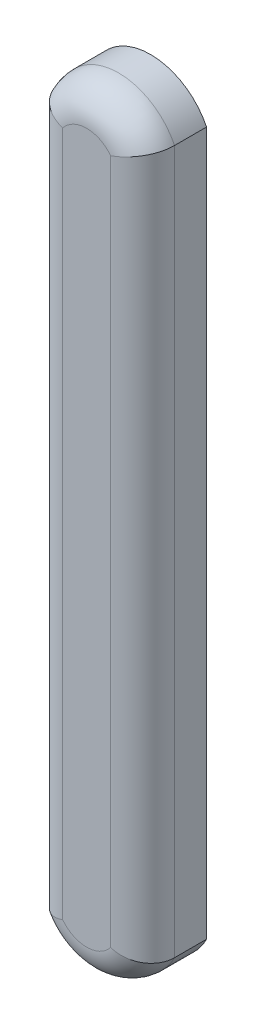
ISO-10303-21;
HEADER;
FILE_DESCRIPTION(('STEP AP214'),'2;1');
FILE_NAME('part.step','',(''),(''),'','','');
FILE_SCHEMA(('AUTOMOTIVE_DESIGN { 1 0 10303 214 1 1 1 1 }'));
ENDSEC;
DATA;
#1=APPLICATION_CONTEXT('core data for automotive mechanical design processes');
#2=APPLICATION_PROTOCOL_DEFINITION('international standard','automotive_design',2000,#1);
#3=PRODUCT_CONTEXT('',#1,'mechanical');
#4=PRODUCT('Part','Part','',(#3));
#5=PRODUCT_RELATED_PRODUCT_CATEGORY('part','',(#4));
#6=PRODUCT_DEFINITION_FORMATION('','',#4);
#7=PRODUCT_DEFINITION_CONTEXT('part definition',#1,'design');
#8=PRODUCT_DEFINITION('design','',#6,#7);
#9=PRODUCT_DEFINITION_SHAPE('','',#8);
#10=(LENGTH_UNIT() NAMED_UNIT(*) SI_UNIT(.MILLI.,.METRE.));
#11=(NAMED_UNIT(*) PLANE_ANGLE_UNIT() SI_UNIT($,.RADIAN.));
#12=(NAMED_UNIT(*) SI_UNIT($,.STERADIAN.) SOLID_ANGLE_UNIT());
#13=UNCERTAINTY_MEASURE_WITH_UNIT(LENGTH_MEASURE(1.E-05),#10,'distance_accuracy_value','');
#14=(GEOMETRIC_REPRESENTATION_CONTEXT(3) GLOBAL_UNCERTAINTY_ASSIGNED_CONTEXT((#13)) GLOBAL_UNIT_ASSIGNED_CONTEXT((#10,
#11,#12)) REPRESENTATION_CONTEXT('',''));
#15=CARTESIAN_POINT('',(0.,0.,0.));
#16=DIRECTION('',(0.,0.,1.));
#17=DIRECTION('',(1.,0.,0.));
#18=AXIS2_PLACEMENT_3D('',#15,#16,#17);
#19=CARTESIAN_POINT('',(0.175,0.0859698267459457,0.2));
#20=DIRECTION('',(0.,0.,-1.));
#21=DIRECTION('',(-1.,0.,0.));
#22=AXIS2_PLACEMENT_3D('',#19,#20,#21);
#23=CYLINDRICAL_SURFACE('',#22,0.194976437321867);
#24=DIRECTION('',(0.,0.,-1.));
#25=VECTOR('',#24,1.);
#26=CARTESIAN_POINT('',(0.35,0.,0.2));
#27=LINE('',#26,#25);
#28=CARTESIAN_POINT('',(0.35,0.,0.1));
#29=VERTEX_POINT('',#28);
#30=CARTESIAN_POINT('',(0.35,0.,0.));
#31=VERTEX_POINT('',#30);
#32=EDGE_CURVE('E92',#29,#31,#27,.T.);
#33=ORIENTED_EDGE('',*,*,#32,.F.);
#34=CARTESIAN_POINT('',(0.175,0.0859698267459457,0.1));
#35=DIRECTION('',(0.,0.,1.));
#36=DIRECTION('',(1.,0.,0.));
#37=AXIS2_PLACEMENT_3D('',#34,#35,#36);
#38=CIRCLE('',#37,0.194976437321867);
#39=CARTESIAN_POINT('',(0.,0.,0.1));
#40=VERTEX_POINT('',#39);
#41=EDGE_CURVE('E134',#29,#40,#38,.F.);
#42=ORIENTED_EDGE('',*,*,#41,.T.);
#43=DIRECTION('',(0.,0.,-1.));
#44=VECTOR('',#43,1.);
#45=CARTESIAN_POINT('',(0.,0.,0.2));
#46=LINE('',#45,#44);
#47=CARTESIAN_POINT('',(0.,0.,0.));
#48=VERTEX_POINT('',#47);
#49=EDGE_CURVE('E113',#40,#48,#46,.T.);
#50=ORIENTED_EDGE('',*,*,#49,.T.);
#51=CARTESIAN_POINT('',(0.175,0.0859698267459457,0.));
#52=DIRECTION('',(0.,0.,1.));
#53=DIRECTION('',(1.,0.,0.));
#54=AXIS2_PLACEMENT_3D('',#51,#52,#53);
#55=CIRCLE('',#54,0.194976437321867);
#56=EDGE_CURVE('E109',#48,#31,#55,.T.);
#57=ORIENTED_EDGE('',*,*,#56,.T.);
#58=EDGE_LOOP('',(#33,#42,#50,#57));
#59=FACE_BOUND('',#58,.T.);
#60=ADVANCED_FACE('F33',(#59),#23,.T.);
#61=CARTESIAN_POINT('',(0.35,0.,0.2));
#62=DIRECTION('',(-1.,0.,0.));
#63=DIRECTION('',(0.,0.,1.));
#64=AXIS2_PLACEMENT_3D('',#61,#62,#63);
#65=PLANE('',#64);
#66=DIRECTION('',(0.,0.,-1.));
#67=VECTOR('',#66,1.);
#68=CARTESIAN_POINT('',(0.35,2.2,0.2));
#69=LINE('',#68,#67);
#70=CARTESIAN_POINT('',(0.35,2.2,0.1));
#71=VERTEX_POINT('',#70);
#72=CARTESIAN_POINT('',(0.35,2.2,0.));
#73=VERTEX_POINT('',#72);
#74=EDGE_CURVE('E103',#71,#73,#69,.T.);
#75=ORIENTED_EDGE('',*,*,#74,.F.);
#76=DIRECTION('',(0.,1.,0.));
#77=VECTOR('',#76,1.);
#78=CARTESIAN_POINT('',(0.35,0.,0.1));
#79=LINE('',#78,#77);
#80=EDGE_CURVE('E47',#71,#29,#79,.F.);
#81=ORIENTED_EDGE('',*,*,#80,.T.);
#82=ORIENTED_EDGE('',*,*,#32,.T.);
#83=DIRECTION('',(0.,1.,0.));
#84=VECTOR('',#83,1.);
#85=CARTESIAN_POINT('',(0.35,0.,0.));
#86=LINE('',#85,#84);
#87=EDGE_CURVE('E95',#31,#73,#86,.T.);
#88=ORIENTED_EDGE('',*,*,#87,.T.);
#89=EDGE_LOOP('',(#75,#81,#82,#88));
#90=FACE_BOUND('',#89,.T.);
#91=ADVANCED_FACE('F94',(#90),#65,.F.);
#92=CARTESIAN_POINT('',(0.175,2.11403017325405,0.2));
#93=DIRECTION('',(0.,0.,-1.));
#94=DIRECTION('',(-1.,0.,0.));
#95=AXIS2_PLACEMENT_3D('',#92,#93,#94);
#96=CYLINDRICAL_SURFACE('',#95,0.194976437321867);
#97=DIRECTION('',(0.,0.,-1.));
#98=VECTOR('',#97,1.);
#99=CARTESIAN_POINT('',(0.,2.2,0.2));
#100=LINE('',#99,#98);
#101=CARTESIAN_POINT('',(0.,2.2,0.1));
#102=VERTEX_POINT('',#101);
#103=CARTESIAN_POINT('',(0.,2.2,0.));
#104=VERTEX_POINT('',#103);
#105=EDGE_CURVE('E123',#102,#104,#100,.T.);
#106=ORIENTED_EDGE('',*,*,#105,.F.);
#107=CARTESIAN_POINT('',(0.175,2.11403017325405,0.1));
#108=DIRECTION('',(0.,0.,1.));
#109=DIRECTION('',(1.,0.,0.));
#110=AXIS2_PLACEMENT_3D('',#107,#108,#109);
#111=CIRCLE('',#110,0.194976437321867);
#112=EDGE_CURVE('E11',#102,#71,#111,.F.);
#113=ORIENTED_EDGE('',*,*,#112,.T.);
#114=ORIENTED_EDGE('',*,*,#74,.T.);
#115=CARTESIAN_POINT('',(0.175,2.11403017325405,0.));
#116=DIRECTION('',(0.,0.,1.));
#117=DIRECTION('',(-1.,0.,0.));
#118=AXIS2_PLACEMENT_3D('',#115,#116,#117);
#119=CIRCLE('',#118,0.194976437321867);
#120=EDGE_CURVE('E111',#73,#104,#119,.T.);
#121=ORIENTED_EDGE('',*,*,#120,.T.);
#122=EDGE_LOOP('',(#106,#113,#114,#121));
#123=FACE_BOUND('',#122,.T.);
#124=ADVANCED_FACE('F176',(#123),#96,.T.);
#125=CARTESIAN_POINT('',(0.,0.,0.2));
#126=DIRECTION('',(1.,0.,0.));
#127=DIRECTION('',(0.,0.,-1.));
#128=AXIS2_PLACEMENT_3D('',#125,#126,#127);
#129=PLANE('',#128);
#130=ORIENTED_EDGE('',*,*,#49,.F.);
#131=DIRECTION('',(0.,-1.,0.));
#132=VECTOR('',#131,1.);
#133=CARTESIAN_POINT('',(0.,2.2,0.1));
#134=LINE('',#133,#132);
#135=EDGE_CURVE('E61',#40,#102,#134,.F.);
#136=ORIENTED_EDGE('',*,*,#135,.T.);
#137=ORIENTED_EDGE('',*,*,#105,.T.);
#138=DIRECTION('',(0.,-1.,0.));
#139=VECTOR('',#138,1.);
#140=CARTESIAN_POINT('',(0.,0.,0.));
#141=LINE('',#140,#139);
#142=EDGE_CURVE('E120',#104,#48,#141,.T.);
#143=ORIENTED_EDGE('',*,*,#142,.T.);
#144=EDGE_LOOP('',(#130,#136,#137,#143));
#145=FACE_BOUND('',#144,.T.);
#146=ADVANCED_FACE('F175',(#145),#129,.F.);
#147=CARTESIAN_POINT('',(0.175,0.0859698267459457,0.2));
#148=DIRECTION('',(0.,0.,1.));
#149=DIRECTION('',(1.,0.,0.));
#150=AXIS2_PLACEMENT_3D('',#147,#148,#149);
#151=PLANE('',#150);
#152=DIRECTION('',(0.,-1.,0.));
#153=VECTOR('',#152,1.);
#154=CARTESIAN_POINT('',(0.1,0.,0.2));
#155=LINE('',#154,#153);
#156=CARTESIAN_POINT('',(0.100000000000006,2.17230129514437,0.2));
#157=VERTEX_POINT('',#156);
#158=CARTESIAN_POINT('',(0.1,0.0276987048556348,0.2));
#159=VERTEX_POINT('',#158);
#160=EDGE_CURVE('E129',#157,#159,#155,.T.);
#161=ORIENTED_EDGE('',*,*,#160,.T.);
#162=CARTESIAN_POINT('',(0.175,0.0859698267459457,0.2));
#163=DIRECTION('',(0.,0.,1.));
#164=DIRECTION('',(1.,0.,0.));
#165=AXIS2_PLACEMENT_3D('',#162,#163,#164);
#166=CIRCLE('',#165,0.0949764373218671);
#167=CARTESIAN_POINT('',(0.25,0.0276987048556345,0.2));
#168=VERTEX_POINT('',#167);
#169=EDGE_CURVE('E131',#159,#168,#166,.T.);
#170=ORIENTED_EDGE('',*,*,#169,.T.);
#171=DIRECTION('',(0.,1.,0.));
#172=VECTOR('',#171,1.);
#173=CARTESIAN_POINT('',(0.25,2.2,0.2));
#174=LINE('',#173,#172);
#175=CARTESIAN_POINT('',(0.249999999999994,2.17230129514437,0.2));
#176=VERTEX_POINT('',#175);
#177=EDGE_CURVE('E127',#168,#176,#174,.T.);
#178=ORIENTED_EDGE('',*,*,#177,.T.);
#179=CARTESIAN_POINT('',(0.175,2.11403017325405,0.2));
#180=DIRECTION('',(0.,0.,1.));
#181=DIRECTION('',(1.,0.,0.));
#182=AXIS2_PLACEMENT_3D('',#179,#180,#181);
#183=CIRCLE('',#182,0.0949764373218672);
#184=EDGE_CURVE('E102',#176,#157,#183,.T.);
#185=ORIENTED_EDGE('',*,*,#184,.T.);
#186=EDGE_LOOP('',(#161,#170,#178,#185));
#187=FACE_BOUND('',#186,.T.);
#188=ADVANCED_FACE('F180',(#187),#151,.T.);
#189=CARTESIAN_POINT('',(0.175,0.0859698267459457,0.));
#190=DIRECTION('',(0.,0.,1.));
#191=DIRECTION('',(1.,0.,0.));
#192=AXIS2_PLACEMENT_3D('',#189,#190,#191);
#193=PLANE('',#192);
#194=ORIENTED_EDGE('',*,*,#56,.F.);
#195=ORIENTED_EDGE('',*,*,#142,.F.);
#196=ORIENTED_EDGE('',*,*,#120,.F.);
#197=ORIENTED_EDGE('',*,*,#87,.F.);
#198=EDGE_LOOP('',(#194,#195,#196,#197));
#199=FACE_BOUND('',#198,.T.);
#200=ADVANCED_FACE('F107',(#199),#193,.F.);
#201=CARTESIAN_POINT('',(0.175,2.11403017325405,0.1));
#202=DIRECTION('',(0.,0.,1.));
#203=DIRECTION('',(1.,0.,0.));
#204=AXIS2_PLACEMENT_3D('',#201,#202,#203);
#205=DEGENERATE_TOROIDAL_SURFACE('',#204,0.0949764373218672,0.1,.T.);
#206=CARTESIAN_POINT('',(0.35,2.2,0.1));
#207=CARTESIAN_POINT('',(0.350005268670267,2.20000040754592,0.105511252154056));
#208=CARTESIAN_POINT('',(0.349544726083473,2.19989418803524,0.111020433796739));
#209=CARTESIAN_POINT('',(0.347731528858172,2.19947173953325,0.121874551323155));
#210=CARTESIAN_POINT('',(0.346380049196348,2.19915578713593,0.127219693839957));
#211=CARTESIAN_POINT('',(0.342823791248484,2.19831698281915,0.137602422816504));
#212=CARTESIAN_POINT('',(0.340618769337371,2.1977940718269,0.142639920990146));
#213=CARTESIAN_POINT('',(0.335428566635515,2.19654702816146,0.152267062418119));
#214=CARTESIAN_POINT('',(0.332443445191162,2.19582291079487,0.156856739704144));
#215=CARTESIAN_POINT('',(0.325756614399063,2.19417319123095,0.165506423196409));
#216=CARTESIAN_POINT('',(0.322048708236536,2.19324583736037,0.169561300463762));
#217=CARTESIAN_POINT('',(0.314048358880857,2.19120195336536,0.176991039421652));
#218=CARTESIAN_POINT('',(0.309755728604854,2.19008536266644,0.18036568261043));
#219=CARTESIAN_POINT('',(0.300608968757441,2.1876441832273,0.186426554884238));
#220=CARTESIAN_POINT('',(0.295743946563814,2.18631529375002,0.189094582015616));
#221=CARTESIAN_POINT('',(0.285685701853069,2.18347998727226,0.193577836216799));
#222=CARTESIAN_POINT('',(0.280492611405467,2.18197364150132,0.195393404007875));
#223=CARTESIAN_POINT('',(0.271464682749297,2.17925574089153,0.197746196020681));
#224=CARTESIAN_POINT('',(0.267672328405756,2.17808525366685,0.198501401199194));
#225=CARTESIAN_POINT('',(0.260055477527481,2.17566401718499,0.199567195235984));
#226=CARTESIAN_POINT('',(0.25623103898922,2.17441339335639,0.199878461996796));
#227=CARTESIAN_POINT('',(0.251610866919887,2.17285157075458,0.199990299901761));
#228=CARTESIAN_POINT('',(0.250805058561448,2.17257728559771,0.200000031817378));
#229=CARTESIAN_POINT('',(0.25,2.17230129514436,0.2));
#230=B_SPLINE_CURVE_WITH_KNOTS('',3,(#206,#207,#208,#209,#210,#211,#212,#213,#214,#215,#216,
#217,#218,#219,#220,#221,#222,#223,#224,#225,#226,#227,#228,#229),.UNSPECIFIED.,.F.,.F.,(4,2,2,
2,2,2,2,2,2,2,2,4),(0.,0.0165104363716612,0.0329991420587914,0.0494925575628399,
0.0659847186886619,0.0826250435228636,0.0992707050000554,0.116310692768043,0.133343863977416,
0.145441145514401,0.157519934417857,0.160073462740983),.UNSPECIFIED.);
#231=EDGE_CURVE('E117',#71,#176,#230,.T.);
#232=ORIENTED_EDGE('',*,*,#231,.F.);
#233=ORIENTED_EDGE('',*,*,#112,.F.);
#234=CARTESIAN_POINT('',(0.,2.2,0.1));
#235=CARTESIAN_POINT('',(-5.26867026748262E-06,2.20000040754592,0.105511252154056));
#236=CARTESIAN_POINT('',(0.000455273916526676,2.19989418803524,0.111020433796739));
#237=CARTESIAN_POINT('',(0.00226847114182762,2.19947173953325,0.121874551323155));
#238=CARTESIAN_POINT('',(0.00361995080365193,2.19915578713593,0.127219693839957));
#239=CARTESIAN_POINT('',(0.00717620875151557,2.19831698281915,0.137602422816504));
#240=CARTESIAN_POINT('',(0.00938123066262879,2.1977940718269,0.142639920990146));
#241=CARTESIAN_POINT('',(0.0145714333644853,2.19654702816146,0.152267062418119));
#242=CARTESIAN_POINT('',(0.0175565548088385,2.19582291079487,0.156856739704145));
#243=CARTESIAN_POINT('',(0.0242433856009375,2.19417319123095,0.165506423196409));
#244=CARTESIAN_POINT('',(0.0279512917634645,2.19324583736037,0.169561300463762));
#245=CARTESIAN_POINT('',(0.0359516411191437,2.19120195336536,0.176991039421652));
#246=CARTESIAN_POINT('',(0.0402442713951462,2.19008536266644,0.18036568261043));
#247=CARTESIAN_POINT('',(0.0493910312425594,2.1876441832273,0.186426554884238));
#248=CARTESIAN_POINT('',(0.0542560534361864,2.18631529375002,0.189094582015617));
#249=CARTESIAN_POINT('',(0.0643142981469309,2.18347998727226,0.193577836216799));
#250=CARTESIAN_POINT('',(0.0695073885945332,2.18197364150132,0.195393404007875));
#251=CARTESIAN_POINT('',(0.0785353172507031,2.17925574089153,0.197746196020681));
#252=CARTESIAN_POINT('',(0.0823276715942445,2.17808525366685,0.198501401199194));
#253=CARTESIAN_POINT('',(0.0899445224725191,2.17566401718499,0.199567195235984));
#254=CARTESIAN_POINT('',(0.09376896101078,2.17441339335639,0.199878461996796));
#255=CARTESIAN_POINT('',(0.0983891330801134,2.17285157075458,0.199990299901761));
#256=CARTESIAN_POINT('',(0.0991949414385524,2.17257728559771,0.200000031817378));
#257=CARTESIAN_POINT('',(0.1,2.17230129514436,0.2));
#258=B_SPLINE_CURVE_WITH_KNOTS('',3,(#234,#235,#236,#237,#238,#239,#240,#241,#242,#243,#244,
#245,#246,#247,#248,#249,#250,#251,#252,#253,#254,#255,#256,#257),.UNSPECIFIED.,.F.,.F.,(4,2,2,
2,2,2,2,2,2,2,2,4),(0.,0.0165104363716612,0.0329991420587915,0.04949255756284,
0.0659847186886619,0.0826250435228637,0.0992707050000555,0.116310692768043,0.133343863977416,
0.145441145514401,0.157519934417857,0.160073462740983),.UNSPECIFIED.);
#259=EDGE_CURVE('E38',#157,#102,#258,.F.);
#260=ORIENTED_EDGE('',*,*,#259,.F.);
#261=ORIENTED_EDGE('',*,*,#184,.F.);
#262=EDGE_LOOP('',(#232,#233,#260,#261));
#263=FACE_BOUND('',#262,.T.);
#264=ADVANCED_FACE('F35',(#263),#205,.T.);
#265=CARTESIAN_POINT('',(0.1,0.0859698267459457,0.1));
#266=DIRECTION('',(0.,1.,0.));
#267=DIRECTION('',(0.,0.,1.));
#268=AXIS2_PLACEMENT_3D('',#265,#266,#267);
#269=CYLINDRICAL_SURFACE('',#268,0.1);
#270=ORIENTED_EDGE('',*,*,#259,.T.);
#271=ORIENTED_EDGE('',*,*,#135,.F.);
#272=CARTESIAN_POINT('',(0.,0.,0.1));
#273=CARTESIAN_POINT('',(-5.26867026746337E-06,-4.07545918043041E-07,0.105511252154056));
#274=CARTESIAN_POINT('',(0.000455273916526693,0.00010581196475547,0.111020433796739));
#275=CARTESIAN_POINT('',(0.00226847114182762,0.000528260466754612,0.121874551323155));
#276=CARTESIAN_POINT('',(0.00361995080365192,0.00084421286407005,0.127219693839957));
#277=CARTESIAN_POINT('',(0.00717620875151555,0.00168301718085004,0.137602422816504));
#278=CARTESIAN_POINT('',(0.00938123066262876,0.00220592817310267,0.142639920990146));
#279=CARTESIAN_POINT('',(0.0145714333644852,0.00345297183853683,0.152267062418119));
#280=CARTESIAN_POINT('',(0.0175565548088385,0.00417708920512643,0.156856739704144));
#281=CARTESIAN_POINT('',(0.0242433856009374,0.00582680876905417,0.165506423196409));
#282=CARTESIAN_POINT('',(0.0279512917634644,0.00675416263962726,0.169561300463762));
#283=CARTESIAN_POINT('',(0.0359516411191436,0.00879804663464377,0.176991039421652));
#284=CARTESIAN_POINT('',(0.0402442713951461,0.00991463733356407,0.18036568261043));
#285=CARTESIAN_POINT('',(0.0493910312425594,0.0123558167727031,0.186426554884238));
#286=CARTESIAN_POINT('',(0.0542560534361864,0.0136847062499833,0.189094582015616));
#287=CARTESIAN_POINT('',(0.0643142981469309,0.0165200127277395,0.193577836216799));
#288=CARTESIAN_POINT('',(0.0695073885945331,0.0180263584986781,0.195393404007875));
#289=CARTESIAN_POINT('',(0.078535317250703,0.0207442591084677,0.197746196020681));
#290=CARTESIAN_POINT('',(0.0823276715942444,0.0219147463331536,0.198501401199194));
#291=CARTESIAN_POINT('',(0.089944522472519,0.0243359828150113,0.199567195235984));
#292=CARTESIAN_POINT('',(0.0937689610107799,0.0255866066436067,0.199878461996796));
#293=CARTESIAN_POINT('',(0.0983891330801134,0.0271484292454209,0.199990299901761));
#294=CARTESIAN_POINT('',(0.0991949414385524,0.0274227144022897,0.200000031817378));
#295=CARTESIAN_POINT('',(0.1,0.0276987048556429,0.2));
#296=B_SPLINE_CURVE_WITH_KNOTS('',3,(#272,#273,#274,#275,#276,#277,#278,#279,#280,#281,#282,
#283,#284,#285,#286,#287,#288,#289,#290,#291,#292,#293,#294,#295),.UNSPECIFIED.,.F.,.F.,(4,2,2,
2,2,2,2,2,2,2,2,4),(0.,0.0165104363716612,0.0329991420587914,0.0494925575628399,
0.0659847186886619,0.0826250435228637,0.0992707050000554,0.116310692768043,0.133343863977416,
0.145441145514401,0.157519934417857,0.160073462740983),.UNSPECIFIED.);
#297=EDGE_CURVE('E146',#159,#40,#296,.F.);
#298=ORIENTED_EDGE('',*,*,#297,.F.);
#299=ORIENTED_EDGE('',*,*,#160,.F.);
#300=EDGE_LOOP('',(#270,#271,#298,#299));
#301=FACE_BOUND('',#300,.T.);
#302=ADVANCED_FACE('F157',(#301),#269,.T.);
#303=CARTESIAN_POINT('',(0.25,0.0859698267459457,0.1));
#304=DIRECTION('',(0.,-1.,0.));
#305=DIRECTION('',(0.,0.,-1.));
#306=AXIS2_PLACEMENT_3D('',#303,#304,#305);
#307=CYLINDRICAL_SURFACE('',#306,0.1);
#308=ORIENTED_EDGE('',*,*,#231,.T.);
#309=ORIENTED_EDGE('',*,*,#177,.F.);
#310=CARTESIAN_POINT('',(0.35,0.,0.1));
#311=CARTESIAN_POINT('',(0.350005268670267,-4.07545918531255E-07,0.105511252154056));
#312=CARTESIAN_POINT('',(0.349544726083473,0.00010581196475498,0.111020433796739));
#313=CARTESIAN_POINT('',(0.347731528858172,0.00052826046675415,0.121874551323155));
#314=CARTESIAN_POINT('',(0.346380049196348,0.000844212864069616,0.127219693839957));
#315=CARTESIAN_POINT('',(0.342823791248484,0.00168301718084962,0.137602422816504));
#316=CARTESIAN_POINT('',(0.340618769337371,0.00220592817310223,0.142639920990146));
#317=CARTESIAN_POINT('',(0.335428566635515,0.00345297183853637,0.152267062418119));
#318=CARTESIAN_POINT('',(0.332443445191162,0.00417708920512596,0.156856739704144));
#319=CARTESIAN_POINT('',(0.325756614399063,0.00582680876905374,0.165506423196409));
#320=CARTESIAN_POINT('',(0.322048708236536,0.00675416263962687,0.169561300463762));
#321=CARTESIAN_POINT('',(0.314048358880856,0.00879804663464344,0.176991039421652));
#322=CARTESIAN_POINT('',(0.309755728604854,0.00991463733356375,0.18036568261043));
#323=CARTESIAN_POINT('',(0.300608968757441,0.0123558167727028,0.186426554884238));
#324=CARTESIAN_POINT('',(0.295743946563814,0.0136847062499829,0.189094582015616));
#325=CARTESIAN_POINT('',(0.285685701853069,0.0165200127277392,0.193577836216799));
#326=CARTESIAN_POINT('',(0.280492611405467,0.0180263584986777,0.195393404007875));
#327=CARTESIAN_POINT('',(0.271464682749297,0.0207442591084674,0.197746196020681));
#328=CARTESIAN_POINT('',(0.267672328405756,0.0219147463331533,0.198501401199194));
#329=CARTESIAN_POINT('',(0.260055477527481,0.024335982815011,0.199567195235984));
#330=CARTESIAN_POINT('',(0.25623103898922,0.0255866066436063,0.199878461996796));
#331=CARTESIAN_POINT('',(0.251610866919887,0.0271484292454206,0.199990299901761));
#332=CARTESIAN_POINT('',(0.250805058561448,0.0274227144022894,0.200000031817378));
#333=CARTESIAN_POINT('',(0.25,0.0276987048556426,0.2));
#334=B_SPLINE_CURVE_WITH_KNOTS('',3,(#310,#311,#312,#313,#314,#315,#316,#317,#318,#319,#320,
#321,#322,#323,#324,#325,#326,#327,#328,#329,#330,#331,#332,#333),.UNSPECIFIED.,.F.,.F.,(4,2,2,
2,2,2,2,2,2,2,2,4),(0.,0.0165104363716612,0.0329991420587914,0.0494925575628399,
0.0659847186886618,0.0826250435228636,0.0992707050000554,0.116310692768043,0.133343863977416,
0.145441145514401,0.157519934417857,0.160073462740983),.UNSPECIFIED.);
#335=EDGE_CURVE('E138',#29,#168,#334,.T.);
#336=ORIENTED_EDGE('',*,*,#335,.F.);
#337=ORIENTED_EDGE('',*,*,#80,.F.);
#338=EDGE_LOOP('',(#308,#309,#336,#337));
#339=FACE_BOUND('',#338,.T.);
#340=ADVANCED_FACE('F154',(#339),#307,.T.);
#341=CARTESIAN_POINT('',(0.175,0.0859698267459457,0.1));
#342=DIRECTION('',(0.,0.,1.));
#343=DIRECTION('',(1.,0.,0.));
#344=AXIS2_PLACEMENT_3D('',#341,#342,#343);
#345=DEGENERATE_TOROIDAL_SURFACE('',#344,0.0949764373218671,0.1,.T.);
#346=ORIENTED_EDGE('',*,*,#297,.T.);
#347=ORIENTED_EDGE('',*,*,#41,.F.);
#348=ORIENTED_EDGE('',*,*,#335,.T.);
#349=ORIENTED_EDGE('',*,*,#169,.F.);
#350=EDGE_LOOP('',(#346,#347,#348,#349));
#351=FACE_BOUND('',#350,.T.);
#352=ADVANCED_FACE('F151',(#351),#345,.T.);
#353=CLOSED_SHELL('',(#60,#91,#124,#146,#188,#200,#264,#302,#340,#352));
#354=MANIFOLD_SOLID_BREP('B2',#353);
#355=ADVANCED_BREP_SHAPE_REPRESENTATION('',(#18,#354),#14);
#356=SHAPE_DEFINITION_REPRESENTATION(#9,#355);
ENDSEC;
END-ISO-10303-21;
